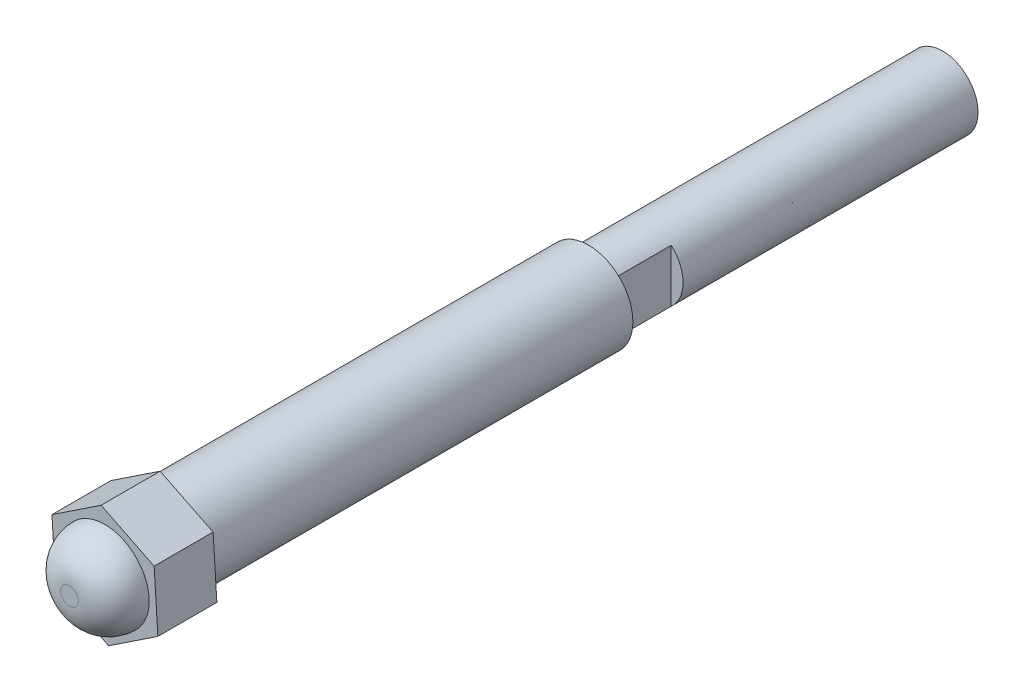
ISO-10303-21;
HEADER;
FILE_DESCRIPTION(('STEP AP214'),'2;1');
FILE_NAME('part.step','',(''),(''),'','','');
FILE_SCHEMA(('AUTOMOTIVE_DESIGN { 1 0 10303 214 1 1 1 1 }'));
ENDSEC;
DATA;
#1=APPLICATION_CONTEXT('core data for automotive mechanical design processes');
#2=APPLICATION_PROTOCOL_DEFINITION('international standard','automotive_design',2000,#1);
#3=PRODUCT_CONTEXT('',#1,'mechanical');
#4=PRODUCT('Part','Part','',(#3));
#5=PRODUCT_RELATED_PRODUCT_CATEGORY('part','',(#4));
#6=PRODUCT_DEFINITION_FORMATION('','',#4);
#7=PRODUCT_DEFINITION_CONTEXT('part definition',#1,'design');
#8=PRODUCT_DEFINITION('design','',#6,#7);
#9=PRODUCT_DEFINITION_SHAPE('','',#8);
#10=(LENGTH_UNIT() NAMED_UNIT(*) SI_UNIT(.MILLI.,.METRE.));
#11=(NAMED_UNIT(*) PLANE_ANGLE_UNIT() SI_UNIT($,.RADIAN.));
#12=(NAMED_UNIT(*) SI_UNIT($,.STERADIAN.) SOLID_ANGLE_UNIT());
#13=UNCERTAINTY_MEASURE_WITH_UNIT(LENGTH_MEASURE(1.E-05),#10,'distance_accuracy_value','');
#14=(GEOMETRIC_REPRESENTATION_CONTEXT(3) GLOBAL_UNCERTAINTY_ASSIGNED_CONTEXT((#13)) GLOBAL_UNIT_ASSIGNED_CONTEXT((#10,
#11,#12)) REPRESENTATION_CONTEXT('',''));
#15=CARTESIAN_POINT('',(0.,0.,0.));
#16=DIRECTION('',(0.,0.,1.));
#17=DIRECTION('',(1.,0.,0.));
#18=AXIS2_PLACEMENT_3D('',#15,#16,#17);
#19=CARTESIAN_POINT('',(0.,0.,55.88));
#20=DIRECTION('',(0.,0.,-1.));
#21=DIRECTION('',(-1.,0.,0.));
#22=AXIS2_PLACEMENT_3D('',#19,#20,#21);
#23=CYLINDRICAL_SURFACE('',#22,4.7625);
#24=CARTESIAN_POINT('',(0.,0.,0.));
#25=DIRECTION('',(0.,0.,1.));
#26=DIRECTION('',(1.,0.,0.));
#27=AXIS2_PLACEMENT_3D('',#24,#25,#26);
#28=CIRCLE('',#27,4.7625);
#29=CARTESIAN_POINT('',(4.7625,0.,0.));
#30=VERTEX_POINT('',#29);
#31=EDGE_CURVE('E179',#30,#30,#28,.T.);
#32=ORIENTED_EDGE('',*,*,#31,.T.);
#33=EDGE_LOOP('',(#32));
#34=FACE_BOUND('',#33,.T.);
#35=CARTESIAN_POINT('',(0.,0.,45.72));
#36=DIRECTION('',(0.,0.,1.));
#37=DIRECTION('',(1.,0.,0.));
#38=AXIS2_PLACEMENT_3D('',#35,#36,#37);
#39=CIRCLE('',#38,4.7625);
#40=CARTESIAN_POINT('',(4.7625,0.,45.72));
#41=VERTEX_POINT('',#40);
#42=EDGE_CURVE('E11',#41,#41,#39,.T.);
#43=ORIENTED_EDGE('',*,*,#42,.F.);
#44=EDGE_LOOP('',(#43));
#45=FACE_BOUND('',#44,.T.);
#46=ADVANCED_FACE('F43',(#34,#45),#23,.T.);
#47=CARTESIAN_POINT('',(0.,0.,0.));
#48=DIRECTION('',(0.,0.,1.));
#49=DIRECTION('',(1.,0.,0.));
#50=AXIS2_PLACEMENT_3D('',#47,#48,#49);
#51=PLANE('',#50);
#52=DIRECTION('',(0.,1.,0.));
#53=VECTOR('',#52,1.);
#54=CARTESIAN_POINT('',(-2.54,-19.05,0.));
#55=LINE('',#54,#53);
#56=CARTESIAN_POINT('',(-2.54,-2.83980633142474,0.));
#57=VERTEX_POINT('',#56);
#58=CARTESIAN_POINT('',(-2.54,2.83980633142472,0.));
#59=VERTEX_POINT('',#58);
#60=EDGE_CURVE('E167',#57,#59,#55,.T.);
#61=ORIENTED_EDGE('',*,*,#60,.F.);
#62=CARTESIAN_POINT('',(0.,0.,0.));
#63=DIRECTION('',(0.,0.,-1.));
#64=DIRECTION('',(-1.,0.,0.));
#65=AXIS2_PLACEMENT_3D('',#62,#63,#64);
#66=CIRCLE('',#65,3.81);
#67=CARTESIAN_POINT('',(2.54,-2.83980633142474,0.));
#68=VERTEX_POINT('',#67);
#69=EDGE_CURVE('E180',#68,#57,#66,.T.);
#70=ORIENTED_EDGE('',*,*,#69,.F.);
#71=DIRECTION('',(0.,1.,0.));
#72=VECTOR('',#71,1.);
#73=CARTESIAN_POINT('',(2.54,-19.05,0.));
#74=LINE('',#73,#72);
#75=CARTESIAN_POINT('',(2.54,2.83980633142472,0.));
#76=VERTEX_POINT('',#75);
#77=EDGE_CURVE('E170',#68,#76,#74,.T.);
#78=ORIENTED_EDGE('',*,*,#77,.T.);
#79=EDGE_CURVE('E184',#59,#76,#66,.T.);
#80=ORIENTED_EDGE('',*,*,#79,.F.);
#81=EDGE_LOOP('',(#61,#70,#78,#80));
#82=FACE_BOUND('',#81,.T.);
#83=ORIENTED_EDGE('',*,*,#31,.F.);
#84=EDGE_LOOP('',(#83));
#85=FACE_BOUND('',#84,.T.);
#86=ADVANCED_FACE('F235',(#82,#85),#51,.F.);
#87=CARTESIAN_POINT('',(0.,0.,-38.1));
#88=DIRECTION('',(0.,0.,1.));
#89=DIRECTION('',(1.,0.,0.));
#90=AXIS2_PLACEMENT_3D('',#87,#88,#89);
#91=CYLINDRICAL_SURFACE('',#90,3.81);
#92=CARTESIAN_POINT('',(0.,0.,-38.1));
#93=DIRECTION('',(0.,0.,-1.));
#94=DIRECTION('',(-1.,0.,0.));
#95=AXIS2_PLACEMENT_3D('',#92,#93,#94);
#96=CIRCLE('',#95,3.81);
#97=CARTESIAN_POINT('',(-3.81,0.,-38.1));
#98=VERTEX_POINT('',#97);
#99=EDGE_CURVE('E166',#98,#98,#96,.T.);
#100=ORIENTED_EDGE('',*,*,#99,.F.);
#101=EDGE_LOOP('',(#100));
#102=FACE_BOUND('',#101,.T.);
#103=CARTESIAN_POINT('',(0.,0.,-6.35000000000004));
#104=DIRECTION('',(0.,0.,-1.));
#105=DIRECTION('',(-1.,0.,0.));
#106=AXIS2_PLACEMENT_3D('',#103,#104,#105);
#107=CIRCLE('',#106,3.81);
#108=CARTESIAN_POINT('',(-2.54,-2.83980633142473,-6.35000000000003));
#109=VERTEX_POINT('',#108);
#110=CARTESIAN_POINT('',(-2.54,2.83980633142472,-6.35000000000003));
#111=VERTEX_POINT('',#110);
#112=EDGE_CURVE('E204',#109,#111,#107,.T.);
#113=ORIENTED_EDGE('',*,*,#112,.T.);
#114=DIRECTION('',(0.,0.,1.));
#115=VECTOR('',#114,1.);
#116=CARTESIAN_POINT('',(-2.54,2.83980633142473,-38.1));
#117=LINE('',#116,#115);
#118=EDGE_CURVE('E207',#111,#59,#117,.T.);
#119=ORIENTED_EDGE('',*,*,#118,.T.);
#120=ORIENTED_EDGE('',*,*,#79,.T.);
#121=DIRECTION('',(0.,0.,1.));
#122=VECTOR('',#121,1.);
#123=CARTESIAN_POINT('',(2.54,2.83980633142473,-38.1));
#124=LINE('',#123,#122);
#125=CARTESIAN_POINT('',(2.54,2.83980633142473,-6.35000000000004));
#126=VERTEX_POINT('',#125);
#127=EDGE_CURVE('E192',#76,#126,#124,.F.);
#128=ORIENTED_EDGE('',*,*,#127,.T.);
#129=CARTESIAN_POINT('',(0.,0.,-6.35000000000004));
#130=DIRECTION('',(0.,0.,-1.));
#131=DIRECTION('',(-1.,0.,0.));
#132=AXIS2_PLACEMENT_3D('',#129,#130,#131);
#133=CIRCLE('',#132,3.81);
#134=CARTESIAN_POINT('',(2.54,-2.83980633142473,-6.35000000000004));
#135=VERTEX_POINT('',#134);
#136=EDGE_CURVE('E188',#126,#135,#133,.T.);
#137=ORIENTED_EDGE('',*,*,#136,.T.);
#138=DIRECTION('',(0.,0.,1.));
#139=VECTOR('',#138,1.);
#140=CARTESIAN_POINT('',(2.54,-2.83980633142473,-38.1));
#141=LINE('',#140,#139);
#142=EDGE_CURVE('E196',#135,#68,#141,.T.);
#143=ORIENTED_EDGE('',*,*,#142,.T.);
#144=ORIENTED_EDGE('',*,*,#69,.T.);
#145=DIRECTION('',(0.,0.,1.));
#146=VECTOR('',#145,1.);
#147=CARTESIAN_POINT('',(-2.54,-2.83980633142473,-38.1));
#148=LINE('',#147,#146);
#149=EDGE_CURVE('E200',#57,#109,#148,.F.);
#150=ORIENTED_EDGE('',*,*,#149,.T.);
#151=EDGE_LOOP('',(#113,#119,#120,#128,#137,#143,#144,#150));
#152=FACE_BOUND('',#151,.T.);
#153=ADVANCED_FACE('F240',(#102,#152),#91,.T.);
#154=CARTESIAN_POINT('',(0.,0.,-38.1));
#155=DIRECTION('',(0.,0.,-1.));
#156=DIRECTION('',(-1.,0.,0.));
#157=AXIS2_PLACEMENT_3D('',#154,#155,#156);
#158=PLANE('',#157);
#159=CARTESIAN_POINT('',(0.,0.,-38.1));
#160=DIRECTION('',(0.,0.,-1.));
#161=DIRECTION('',(-1.,0.,0.));
#162=AXIS2_PLACEMENT_3D('',#159,#160,#161);
#163=CIRCLE('',#162,1.5875);
#164=CARTESIAN_POINT('',(-1.5875,0.,-38.1));
#165=VERTEX_POINT('',#164);
#166=EDGE_CURVE('E150',#165,#165,#163,.T.);
#167=ORIENTED_EDGE('',*,*,#166,.F.);
#168=EDGE_LOOP('',(#167));
#169=FACE_BOUND('',#168,.T.);
#170=ORIENTED_EDGE('',*,*,#99,.T.);
#171=EDGE_LOOP('',(#170));
#172=FACE_BOUND('',#171,.T.);
#173=ADVANCED_FACE('F333',(#169,#172),#158,.T.);
#174=CARTESIAN_POINT('',(2.54,-19.05,-6.35000000000003));
#175=DIRECTION('',(-1.,0.,0.));
#176=DIRECTION('',(0.,0.,1.));
#177=AXIS2_PLACEMENT_3D('',#174,#175,#176);
#178=PLANE('',#177);
#179=DIRECTION('',(0.,1.,0.));
#180=VECTOR('',#179,1.);
#181=CARTESIAN_POINT('',(2.54,-19.05,-6.35000000000003));
#182=LINE('',#181,#180);
#183=EDGE_CURVE('E66',#135,#126,#182,.T.);
#184=ORIENTED_EDGE('',*,*,#183,.T.);
#185=ORIENTED_EDGE('',*,*,#127,.F.);
#186=ORIENTED_EDGE('',*,*,#77,.F.);
#187=ORIENTED_EDGE('',*,*,#142,.F.);
#188=EDGE_LOOP('',(#184,#185,#186,#187));
#189=FACE_BOUND('',#188,.T.);
#190=ADVANCED_FACE('F330',(#189),#178,.F.);
#191=CARTESIAN_POINT('',(3.81,-19.05,-6.35000000000003));
#192=DIRECTION('',(0.,0.,-1.));
#193=DIRECTION('',(-1.,0.,0.));
#194=AXIS2_PLACEMENT_3D('',#191,#192,#193);
#195=PLANE('',#194);
#196=ORIENTED_EDGE('',*,*,#183,.F.);
#197=ORIENTED_EDGE('',*,*,#136,.F.);
#198=EDGE_LOOP('',(#196,#197));
#199=FACE_BOUND('',#198,.T.);
#200=ADVANCED_FACE('F326',(#199),#195,.F.);
#201=CARTESIAN_POINT('',(-3.81,-19.05,-6.35000000000003));
#202=DIRECTION('',(0.,0.,-1.));
#203=DIRECTION('',(-1.,0.,0.));
#204=AXIS2_PLACEMENT_3D('',#201,#202,#203);
#205=PLANE('',#204);
#206=ORIENTED_EDGE('',*,*,#112,.F.);
#207=DIRECTION('',(0.,1.,0.));
#208=VECTOR('',#207,1.);
#209=CARTESIAN_POINT('',(-2.54,-19.05,-6.35000000000003));
#210=LINE('',#209,#208);
#211=EDGE_CURVE('E59',#109,#111,#210,.T.);
#212=ORIENTED_EDGE('',*,*,#211,.T.);
#213=EDGE_LOOP('',(#206,#212));
#214=FACE_BOUND('',#213,.T.);
#215=ADVANCED_FACE('F323',(#214),#205,.F.);
#216=CARTESIAN_POINT('',(-2.54,-19.05,-6.35000000000003));
#217=DIRECTION('',(1.,0.,0.));
#218=DIRECTION('',(0.,0.,-1.));
#219=AXIS2_PLACEMENT_3D('',#216,#217,#218);
#220=PLANE('',#219);
#221=ORIENTED_EDGE('',*,*,#211,.F.);
#222=ORIENTED_EDGE('',*,*,#149,.F.);
#223=ORIENTED_EDGE('',*,*,#60,.T.);
#224=ORIENTED_EDGE('',*,*,#118,.F.);
#225=EDGE_LOOP('',(#221,#222,#223,#224));
#226=FACE_BOUND('',#225,.T.);
#227=ADVANCED_FACE('F321',(#226),#220,.F.);
#228=CARTESIAN_POINT('',(0.,0.,0.));
#229=DIRECTION('',(0.,0.,1.));
#230=DIRECTION('',(1.,0.,0.));
#231=AXIS2_PLACEMENT_3D('',#228,#229,#230);
#232=PLANE('',#231);
#233=CARTESIAN_POINT('',(0.,0.,0.));
#234=DIRECTION('',(0.,0.,1.));
#235=DIRECTION('',(1.,0.,0.));
#236=AXIS2_PLACEMENT_3D('',#233,#234,#235);
#237=CIRCLE('',#236,1.5875);
#238=CARTESIAN_POINT('',(1.5875,0.,0.));
#239=VERTEX_POINT('',#238);
#240=EDGE_CURVE('E155',#239,#239,#237,.F.);
#241=ORIENTED_EDGE('',*,*,#240,.T.);
#242=EDGE_LOOP('',(#241));
#243=FACE_BOUND('',#242,.T.);
#244=ADVANCED_FACE('F317',(#243),#232,.F.);
#245=CARTESIAN_POINT('',(0.,0.,4.49012806053457));
#246=DIRECTION('',(0.,0.,-1.));
#247=DIRECTION('',(-1.,0.,0.));
#248=AXIS2_PLACEMENT_3D('',#245,#246,#247);
#249=CYLINDRICAL_SURFACE('',#248,1.5875);
#250=ORIENTED_EDGE('',*,*,#166,.T.);
#251=EDGE_LOOP('',(#250));
#252=FACE_BOUND('',#251,.T.);
#253=ORIENTED_EDGE('',*,*,#240,.F.);
#254=EDGE_LOOP('',(#253));
#255=FACE_BOUND('',#254,.T.);
#256=ADVANCED_FACE('F314',(#252,#255),#249,.F.);
#257=CARTESIAN_POINT('',(0.404492036425935,-6.35,52.07));
#258=DIRECTION('',(-0.554042502091303,0.832488381826683,0.));
#259=DIRECTION('',(-0.832488381826683,-0.554042502091303,0.));
#260=AXIS2_PLACEMENT_3D('',#257,#258,#259);
#261=PLANE('',#260);
#262=DIRECTION('',(0.832488381826683,0.554042502091303,0.));
#263=VECTOR('',#262,1.);
#264=CARTESIAN_POINT('',(0.404492036425935,-6.35,45.72));
#265=LINE('',#264,#263);
#266=CARTESIAN_POINT('',(0.404492036425935,-6.35,45.72));
#267=VERTEX_POINT('',#266);
#268=CARTESIAN_POINT('',(5.70150733224415,-2.82469962082663,45.72));
#269=VERTEX_POINT('',#268);
#270=EDGE_CURVE('E148',#267,#269,#265,.T.);
#271=ORIENTED_EDGE('',*,*,#270,.T.);
#272=DIRECTION('',(0.,0.,-1.));
#273=VECTOR('',#272,1.);
#274=CARTESIAN_POINT('',(5.70150733224415,-2.82469962082663,52.07));
#275=LINE('',#274,#273);
#276=CARTESIAN_POINT('',(5.70150733224415,-2.82469962082663,52.07));
#277=VERTEX_POINT('',#276);
#278=EDGE_CURVE('E126',#277,#269,#275,.T.);
#279=ORIENTED_EDGE('',*,*,#278,.F.);
#280=DIRECTION('',(0.832488381826683,0.554042502091303,0.));
#281=VECTOR('',#280,1.);
#282=CARTESIAN_POINT('',(0.404492036425935,-6.35,52.07));
#283=LINE('',#282,#281);
#284=CARTESIAN_POINT('',(0.404492036425935,-6.35,52.07));
#285=VERTEX_POINT('',#284);
#286=EDGE_CURVE('E134',#285,#277,#283,.T.);
#287=ORIENTED_EDGE('',*,*,#286,.F.);
#288=DIRECTION('',(0.,0.,-1.));
#289=VECTOR('',#288,1.);
#290=CARTESIAN_POINT('',(0.404492036425935,-6.35,52.07));
#291=LINE('',#290,#289);
#292=EDGE_CURVE('E268',#285,#267,#291,.T.);
#293=ORIENTED_EDGE('',*,*,#292,.T.);
#294=EDGE_LOOP('',(#271,#279,#287,#293));
#295=FACE_BOUND('',#294,.T.);
#296=ADVANCED_FACE('F146',(#295),#261,.F.);
#297=CARTESIAN_POINT('',(5.70150733224415,-2.82469962082663,52.07));
#298=DIRECTION('',(-0.997977338062958,-0.0635706906740195,0.));
#299=DIRECTION('',(0.0635706906740195,-0.997977338062958,0.));
#300=AXIS2_PLACEMENT_3D('',#297,#298,#299);
#301=PLANE('',#300);
#302=DIRECTION('',(-0.0635706906740195,0.997977338062958,0.));
#303=VECTOR('',#302,1.);
#304=CARTESIAN_POINT('',(5.70150733224415,-2.82469962082663,45.72));
#305=LINE('',#304,#303);
#306=CARTESIAN_POINT('',(5.29701529581822,3.52530037917336,45.72));
#307=VERTEX_POINT('',#306);
#308=EDGE_CURVE('E249',#269,#307,#305,.T.);
#309=ORIENTED_EDGE('',*,*,#308,.T.);
#310=DIRECTION('',(0.,0.,-1.));
#311=VECTOR('',#310,1.);
#312=CARTESIAN_POINT('',(5.29701529581822,3.52530037917336,52.07));
#313=LINE('',#312,#311);
#314=CARTESIAN_POINT('',(5.29701529581822,3.52530037917336,52.07));
#315=VERTEX_POINT('',#314);
#316=EDGE_CURVE('E129',#315,#307,#313,.T.);
#317=ORIENTED_EDGE('',*,*,#316,.F.);
#318=DIRECTION('',(-0.0635706906740195,0.997977338062958,0.));
#319=VECTOR('',#318,1.);
#320=CARTESIAN_POINT('',(5.70150733224415,-2.82469962082663,52.07));
#321=LINE('',#320,#319);
#322=EDGE_CURVE('E122',#277,#315,#321,.T.);
#323=ORIENTED_EDGE('',*,*,#322,.F.);
#324=ORIENTED_EDGE('',*,*,#278,.T.);
#325=EDGE_LOOP('',(#309,#317,#323,#324));
#326=FACE_BOUND('',#325,.T.);
#327=ADVANCED_FACE('F124',(#326),#301,.F.);
#328=CARTESIAN_POINT('',(5.29701529581822,3.52530037917336,52.07));
#329=DIRECTION('',(-0.443934835971656,-0.896059072500702,0.));
#330=DIRECTION('',(0.896059072500702,-0.443934835971656,0.));
#331=AXIS2_PLACEMENT_3D('',#328,#329,#330);
#332=PLANE('',#331);
#333=DIRECTION('',(-0.896059072500702,0.443934835971656,0.));
#334=VECTOR('',#333,1.);
#335=CARTESIAN_POINT('',(5.29701529581822,3.52530037917336,45.72));
#336=LINE('',#335,#334);
#337=CARTESIAN_POINT('',(-0.404492036425935,6.35,45.72));
#338=VERTEX_POINT('',#337);
#339=EDGE_CURVE('E253',#307,#338,#336,.T.);
#340=ORIENTED_EDGE('',*,*,#339,.T.);
#341=DIRECTION('',(0.,0.,-1.));
#342=VECTOR('',#341,1.);
#343=CARTESIAN_POINT('',(-0.404492036425935,6.35,52.07));
#344=LINE('',#343,#342);
#345=CARTESIAN_POINT('',(-0.404492036425935,6.35,52.07));
#346=VERTEX_POINT('',#345);
#347=EDGE_CURVE('E157',#346,#338,#344,.T.);
#348=ORIENTED_EDGE('',*,*,#347,.F.);
#349=DIRECTION('',(-0.896059072500702,0.443934835971656,0.));
#350=VECTOR('',#349,1.);
#351=CARTESIAN_POINT('',(5.29701529581822,3.52530037917336,52.07));
#352=LINE('',#351,#350);
#353=EDGE_CURVE('E133',#315,#346,#352,.T.);
#354=ORIENTED_EDGE('',*,*,#353,.F.);
#355=ORIENTED_EDGE('',*,*,#316,.T.);
#356=EDGE_LOOP('',(#340,#348,#354,#355));
#357=FACE_BOUND('',#356,.T.);
#358=ADVANCED_FACE('F301',(#357),#332,.F.);
#359=CARTESIAN_POINT('',(-0.404492036425935,6.35,52.07));
#360=DIRECTION('',(0.554042502091302,-0.832488381826683,0.));
#361=DIRECTION('',(0.832488381826683,0.554042502091302,0.));
#362=AXIS2_PLACEMENT_3D('',#359,#360,#361);
#363=PLANE('',#362);
#364=DIRECTION('',(-0.832488381826683,-0.554042502091302,0.));
#365=VECTOR('',#364,1.);
#366=CARTESIAN_POINT('',(-0.404492036425935,6.35,45.72));
#367=LINE('',#366,#365);
#368=CARTESIAN_POINT('',(-5.70150733224416,2.82469962082664,45.72));
#369=VERTEX_POINT('',#368);
#370=EDGE_CURVE('E260',#338,#369,#367,.T.);
#371=ORIENTED_EDGE('',*,*,#370,.T.);
#372=DIRECTION('',(0.,0.,-1.));
#373=VECTOR('',#372,1.);
#374=CARTESIAN_POINT('',(-5.70150733224416,2.82469962082664,52.07));
#375=LINE('',#374,#373);
#376=CARTESIAN_POINT('',(-5.70150733224416,2.82469962082664,52.07));
#377=VERTEX_POINT('',#376);
#378=EDGE_CURVE('E275',#377,#369,#375,.T.);
#379=ORIENTED_EDGE('',*,*,#378,.F.);
#380=DIRECTION('',(-0.832488381826683,-0.554042502091302,0.));
#381=VECTOR('',#380,1.);
#382=CARTESIAN_POINT('',(-0.404492036425935,6.35,52.07));
#383=LINE('',#382,#381);
#384=EDGE_CURVE('E286',#346,#377,#383,.T.);
#385=ORIENTED_EDGE('',*,*,#384,.F.);
#386=ORIENTED_EDGE('',*,*,#347,.T.);
#387=EDGE_LOOP('',(#371,#379,#385,#386));
#388=FACE_BOUND('',#387,.T.);
#389=ADVANCED_FACE('F284',(#388),#363,.F.);
#390=CARTESIAN_POINT('',(-5.70150733224416,2.82469962082664,52.07));
#391=DIRECTION('',(0.997977338062958,0.0635706906740193,0.));
#392=DIRECTION('',(-0.0635706906740193,0.997977338062958,0.));
#393=AXIS2_PLACEMENT_3D('',#390,#391,#392);
#394=PLANE('',#393);
#395=DIRECTION('',(0.0635706906740193,-0.997977338062958,0.));
#396=VECTOR('',#395,1.);
#397=CARTESIAN_POINT('',(-5.70150733224416,2.82469962082664,45.72));
#398=LINE('',#397,#396);
#399=CARTESIAN_POINT('',(-5.29701529581822,-3.52530037917336,45.72));
#400=VERTEX_POINT('',#399);
#401=EDGE_CURVE('E263',#369,#400,#398,.T.);
#402=ORIENTED_EDGE('',*,*,#401,.T.);
#403=DIRECTION('',(0.,0.,-1.));
#404=VECTOR('',#403,1.);
#405=CARTESIAN_POINT('',(-5.29701529581822,-3.52530037917336,52.07));
#406=LINE('',#405,#404);
#407=CARTESIAN_POINT('',(-5.29701529581822,-3.52530037917336,52.07));
#408=VERTEX_POINT('',#407);
#409=EDGE_CURVE('E271',#408,#400,#406,.T.);
#410=ORIENTED_EDGE('',*,*,#409,.F.);
#411=DIRECTION('',(0.0635706906740193,-0.997977338062958,0.));
#412=VECTOR('',#411,1.);
#413=CARTESIAN_POINT('',(-5.70150733224416,2.82469962082664,52.07));
#414=LINE('',#413,#412);
#415=EDGE_CURVE('E295',#377,#408,#414,.T.);
#416=ORIENTED_EDGE('',*,*,#415,.F.);
#417=ORIENTED_EDGE('',*,*,#378,.T.);
#418=EDGE_LOOP('',(#402,#410,#416,#417));
#419=FACE_BOUND('',#418,.T.);
#420=ADVANCED_FACE('F290',(#419),#394,.F.);
#421=CARTESIAN_POINT('',(-5.29701529581822,-3.52530037917336,52.07));
#422=DIRECTION('',(0.443934835971656,0.896059072500702,0.));
#423=DIRECTION('',(-0.896059072500702,0.443934835971656,0.));
#424=AXIS2_PLACEMENT_3D('',#421,#422,#423);
#425=PLANE('',#424);
#426=DIRECTION('',(0.896059072500702,-0.443934835971656,0.));
#427=VECTOR('',#426,1.);
#428=CARTESIAN_POINT('',(-5.29701529581822,-3.52530037917336,45.72));
#429=LINE('',#428,#427);
#430=EDGE_CURVE('E144',#400,#267,#429,.T.);
#431=ORIENTED_EDGE('',*,*,#430,.T.);
#432=ORIENTED_EDGE('',*,*,#292,.F.);
#433=DIRECTION('',(0.896059072500702,-0.443934835971656,0.));
#434=VECTOR('',#433,1.);
#435=CARTESIAN_POINT('',(-5.29701529581822,-3.52530037917336,52.07));
#436=LINE('',#435,#434);
#437=EDGE_CURVE('E139',#408,#285,#436,.T.);
#438=ORIENTED_EDGE('',*,*,#437,.F.);
#439=ORIENTED_EDGE('',*,*,#409,.T.);
#440=EDGE_LOOP('',(#431,#432,#438,#439));
#441=FACE_BOUND('',#440,.T.);
#442=ADVANCED_FACE('F293',(#441),#425,.F.);
#443=CARTESIAN_POINT('',(0.,0.,52.07));
#444=DIRECTION('',(0.,0.,1.));
#445=DIRECTION('',(1.,0.,0.));
#446=AXIS2_PLACEMENT_3D('',#443,#444,#445);
#447=PLANE('',#446);
#448=CARTESIAN_POINT('',(0.,0.,52.07));
#449=DIRECTION('',(0.,0.,1.));
#450=DIRECTION('',(1.,0.,0.));
#451=AXIS2_PLACEMENT_3D('',#448,#449,#450);
#452=CIRCLE('',#451,4.7625);
#453=CARTESIAN_POINT('',(4.7625,0.,52.07));
#454=VERTEX_POINT('',#453);
#455=EDGE_CURVE('E52',#454,#454,#452,.F.);
#456=ORIENTED_EDGE('',*,*,#455,.T.);
#457=EDGE_LOOP('',(#456));
#458=FACE_BOUND('',#457,.T.);
#459=ORIENTED_EDGE('',*,*,#286,.T.);
#460=ORIENTED_EDGE('',*,*,#322,.T.);
#461=ORIENTED_EDGE('',*,*,#353,.T.);
#462=ORIENTED_EDGE('',*,*,#384,.T.);
#463=ORIENTED_EDGE('',*,*,#415,.T.);
#464=ORIENTED_EDGE('',*,*,#437,.T.);
#465=EDGE_LOOP('',(#459,#460,#461,#462,#463,#464));
#466=FACE_BOUND('',#465,.T.);
#467=ADVANCED_FACE('F137',(#458,#466),#447,.T.);
#468=CARTESIAN_POINT('',(0.,0.,45.72));
#469=DIRECTION('',(0.,0.,1.));
#470=DIRECTION('',(1.,0.,0.));
#471=AXIS2_PLACEMENT_3D('',#468,#469,#470);
#472=PLANE('',#471);
#473=ORIENTED_EDGE('',*,*,#42,.T.);
#474=EDGE_LOOP('',(#473));
#475=FACE_BOUND('',#474,.T.);
#476=ORIENTED_EDGE('',*,*,#270,.F.);
#477=ORIENTED_EDGE('',*,*,#430,.F.);
#478=ORIENTED_EDGE('',*,*,#401,.F.);
#479=ORIENTED_EDGE('',*,*,#370,.F.);
#480=ORIENTED_EDGE('',*,*,#339,.F.);
#481=ORIENTED_EDGE('',*,*,#308,.F.);
#482=EDGE_LOOP('',(#476,#477,#478,#479,#480,#481));
#483=FACE_BOUND('',#482,.T.);
#484=ADVANCED_FACE('F225',(#475,#483),#472,.F.);
#485=CARTESIAN_POINT('',(0.,0.,55.88));
#486=DIRECTION('',(0.,0.,1.));
#487=DIRECTION('',(1.,0.,0.));
#488=AXIS2_PLACEMENT_3D('',#485,#486,#487);
#489=PLANE('',#488);
#490=CARTESIAN_POINT('',(0.,0.,55.88));
#491=DIRECTION('',(0.,0.,1.));
#492=DIRECTION('',(1.,0.,0.));
#493=AXIS2_PLACEMENT_3D('',#490,#491,#492);
#494=CIRCLE('',#493,0.952500000000001);
#495=CARTESIAN_POINT('',(0.952500000000001,0.,55.88));
#496=VERTEX_POINT('',#495);
#497=EDGE_CURVE('E211',#496,#496,#494,.T.);
#498=ORIENTED_EDGE('',*,*,#497,.T.);
#499=EDGE_LOOP('',(#498));
#500=FACE_BOUND('',#499,.T.);
#501=ADVANCED_FACE('F221',(#500),#489,.T.);
#502=CARTESIAN_POINT('',(0.,0.,52.07));
#503=DIRECTION('',(0.,0.,1.));
#504=DIRECTION('',(1.,0.,0.));
#505=AXIS2_PLACEMENT_3D('',#502,#503,#504);
#506=DEGENERATE_TOROIDAL_SURFACE('',#505,0.952500000000001,3.81,.T.);
#507=ORIENTED_EDGE('',*,*,#455,.F.);
#508=EDGE_LOOP('',(#507));
#509=FACE_BOUND('',#508,.T.);
#510=ORIENTED_EDGE('',*,*,#497,.F.);
#511=EDGE_LOOP('',(#510));
#512=FACE_BOUND('',#511,.T.);
#513=ADVANCED_FACE('F45',(#509,#512),#506,.T.);
#514=CLOSED_SHELL('',(#46,#86,#153,#173,#190,#200,#215,#227,#244,#256,#296,#327,#358,#389,#420,
#442,#467,#484,#501,#513));
#515=MANIFOLD_SOLID_BREP('B2',#514);
#516=ADVANCED_BREP_SHAPE_REPRESENTATION('',(#18,#515),#14);
#517=SHAPE_DEFINITION_REPRESENTATION(#9,#516);
ENDSEC;
END-ISO-10303-21;
